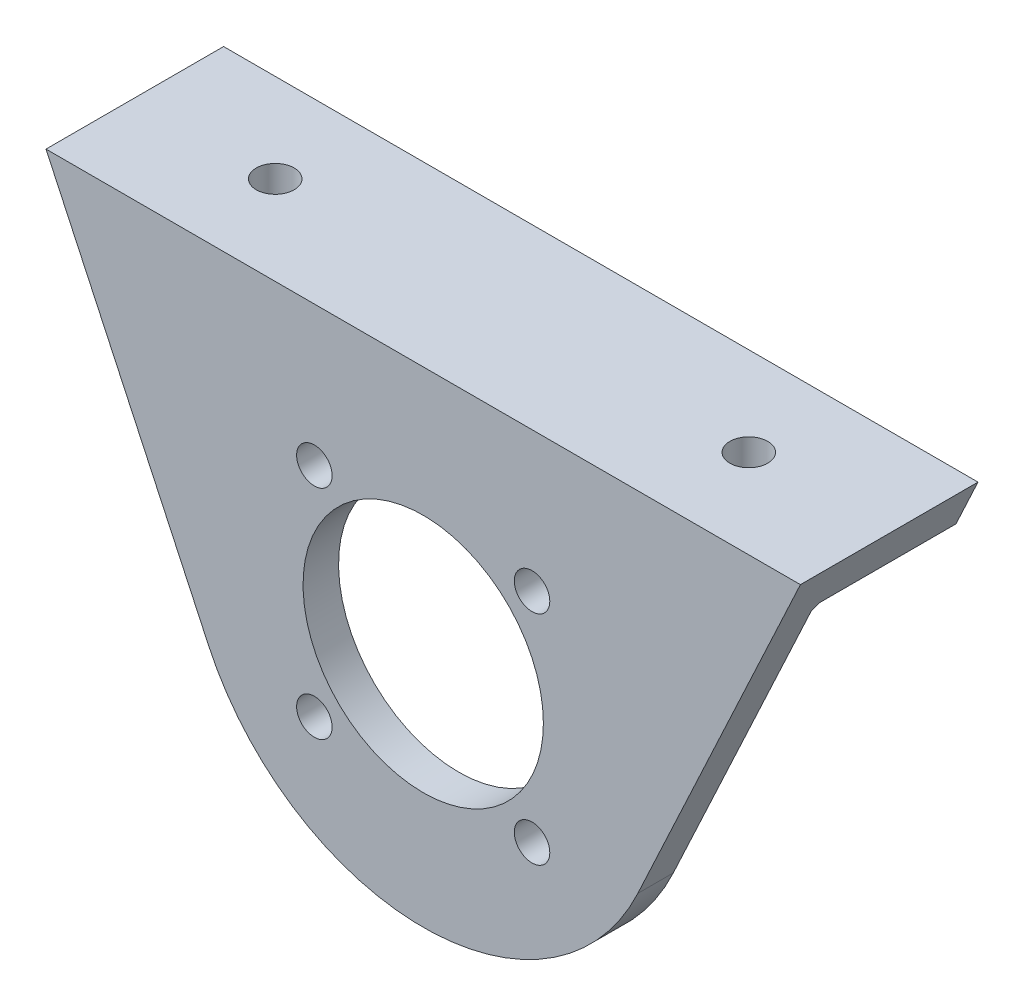
ISO-10303-21;
HEADER;
FILE_DESCRIPTION(('STEP AP214'),'2;1');
FILE_NAME('part.step','',(''),(''),'','','');
FILE_SCHEMA(('AUTOMOTIVE_DESIGN { 1 0 10303 214 1 1 1 1 }'));
ENDSEC;
DATA;
#1=APPLICATION_CONTEXT('core data for automotive mechanical design processes');
#2=APPLICATION_PROTOCOL_DEFINITION('international standard','automotive_design',2000,#1);
#3=PRODUCT_CONTEXT('',#1,'mechanical');
#4=PRODUCT('Part','Part','',(#3));
#5=PRODUCT_RELATED_PRODUCT_CATEGORY('part','',(#4));
#6=PRODUCT_DEFINITION_FORMATION('','',#4);
#7=PRODUCT_DEFINITION_CONTEXT('part definition',#1,'design');
#8=PRODUCT_DEFINITION('design','',#6,#7);
#9=PRODUCT_DEFINITION_SHAPE('','',#8);
#10=(LENGTH_UNIT() NAMED_UNIT(*) SI_UNIT(.MILLI.,.METRE.));
#11=(NAMED_UNIT(*) PLANE_ANGLE_UNIT() SI_UNIT($,.RADIAN.));
#12=(NAMED_UNIT(*) SI_UNIT($,.STERADIAN.) SOLID_ANGLE_UNIT());
#13=UNCERTAINTY_MEASURE_WITH_UNIT(LENGTH_MEASURE(1.E-05),#10,'distance_accuracy_value','');
#14=(GEOMETRIC_REPRESENTATION_CONTEXT(3) GLOBAL_UNCERTAINTY_ASSIGNED_CONTEXT((#13)) GLOBAL_UNIT_ASSIGNED_CONTEXT((#10,
#11,#12)) REPRESENTATION_CONTEXT('',''));
#15=CARTESIAN_POINT('',(0.,0.,0.));
#16=DIRECTION('',(0.,0.,1.));
#17=DIRECTION('',(1.,0.,0.));
#18=AXIS2_PLACEMENT_3D('',#15,#16,#17);
#19=CARTESIAN_POINT('',(0.,0.,15.));
#20=DIRECTION('',(0.,0.,1.));
#21=DIRECTION('',(1.,0.,0.));
#22=AXIS2_PLACEMENT_3D('',#19,#20,#21);
#23=PLANE('',#22);
#24=CARTESIAN_POINT('',(-9.19238815542512,-9.19238815542512,15.));
#25=DIRECTION('',(0.,0.,1.));
#26=DIRECTION('',(1.,0.,0.));
#27=AXIS2_PLACEMENT_3D('',#24,#25,#26);
#28=CIRCLE('',#27,1.5);
#29=CARTESIAN_POINT('',(-7.69238815542512,-9.19238815542512,15.));
#30=VERTEX_POINT('',#29);
#31=EDGE_CURVE('E177',#30,#30,#28,.T.);
#32=ORIENTED_EDGE('',*,*,#31,.F.);
#33=EDGE_LOOP('',(#32));
#34=FACE_BOUND('',#33,.T.);
#35=CARTESIAN_POINT('',(-9.19238815542512,9.19238815542512,15.));
#36=DIRECTION('',(0.,0.,1.));
#37=DIRECTION('',(1.,0.,0.));
#38=AXIS2_PLACEMENT_3D('',#35,#36,#37);
#39=CIRCLE('',#38,1.5);
#40=CARTESIAN_POINT('',(-7.69238815542512,9.19238815542512,15.));
#41=VERTEX_POINT('',#40);
#42=EDGE_CURVE('E185',#41,#41,#39,.T.);
#43=ORIENTED_EDGE('',*,*,#42,.F.);
#44=EDGE_LOOP('',(#43));
#45=FACE_BOUND('',#44,.T.);
#46=CARTESIAN_POINT('',(0.,0.,15.));
#47=DIRECTION('',(0.,0.,1.));
#48=DIRECTION('',(1.,0.,0.));
#49=AXIS2_PLACEMENT_3D('',#46,#47,#48);
#50=CIRCLE('',#49,20.);
#51=CARTESIAN_POINT('',(-18.126155740733,-8.45236523481408,15.));
#52=VERTEX_POINT('',#51);
#53=CARTESIAN_POINT('',(18.126155740733,-8.45236523481408,15.));
#54=VERTEX_POINT('',#53);
#55=EDGE_CURVE('E194',#52,#54,#50,.T.);
#56=ORIENTED_EDGE('',*,*,#55,.T.);
#57=DIRECTION('',(0.422618261740704,0.906307787036648,0.));
#58=VECTOR('',#57,1.);
#59=CARTESIAN_POINT('',(18.126155740733,-8.45236523481408,15.));
#60=LINE('',#59,#58);
#61=CARTESIAN_POINT('',(31.860019200505,21.,15.));
#62=VERTEX_POINT('',#61);
#63=EDGE_CURVE('E198',#54,#62,#60,.T.);
#64=ORIENTED_EDGE('',*,*,#63,.T.);
#65=DIRECTION('',(-1.,0.,0.));
#66=VECTOR('',#65,1.);
#67=CARTESIAN_POINT('',(-31.860019200505,21.,15.));
#68=LINE('',#67,#66);
#69=CARTESIAN_POINT('',(-31.860019200505,21.,15.));
#70=VERTEX_POINT('',#69);
#71=EDGE_CURVE('E202',#62,#70,#68,.T.);
#72=ORIENTED_EDGE('',*,*,#71,.T.);
#73=DIRECTION('',(0.422618261740704,-0.906307787036648,0.));
#74=VECTOR('',#73,1.);
#75=CARTESIAN_POINT('',(-18.126155740733,-8.45236523481408,15.));
#76=LINE('',#75,#74);
#77=EDGE_CURVE('E205',#70,#52,#76,.T.);
#78=ORIENTED_EDGE('',*,*,#77,.T.);
#79=EDGE_LOOP('',(#56,#64,#72,#78));
#80=FACE_BOUND('',#79,.T.);
#81=CARTESIAN_POINT('',(0.,0.,15.));
#82=DIRECTION('',(0.,0.,1.));
#83=DIRECTION('',(1.,0.,0.));
#84=AXIS2_PLACEMENT_3D('',#81,#82,#83);
#85=CIRCLE('',#84,10.15);
#86=CARTESIAN_POINT('',(10.15,0.,15.));
#87=VERTEX_POINT('',#86);
#88=EDGE_CURVE('E189',#87,#87,#85,.T.);
#89=ORIENTED_EDGE('',*,*,#88,.F.);
#90=EDGE_LOOP('',(#89));
#91=FACE_BOUND('',#90,.T.);
#92=CARTESIAN_POINT('',(9.19238815542511,9.19238815542512,15.));
#93=DIRECTION('',(0.,0.,1.));
#94=DIRECTION('',(1.,0.,0.));
#95=AXIS2_PLACEMENT_3D('',#92,#93,#94);
#96=CIRCLE('',#95,1.5);
#97=CARTESIAN_POINT('',(10.6923881554251,9.19238815542512,15.));
#98=VERTEX_POINT('',#97);
#99=EDGE_CURVE('E181',#98,#98,#96,.T.);
#100=ORIENTED_EDGE('',*,*,#99,.F.);
#101=EDGE_LOOP('',(#100));
#102=FACE_BOUND('',#101,.T.);
#103=CARTESIAN_POINT('',(9.19238815542512,-9.19238815542512,15.));
#104=DIRECTION('',(0.,0.,1.));
#105=DIRECTION('',(1.,0.,0.));
#106=AXIS2_PLACEMENT_3D('',#103,#104,#105);
#107=CIRCLE('',#106,1.5);
#108=CARTESIAN_POINT('',(10.6923881554251,-9.19238815542512,15.));
#109=VERTEX_POINT('',#108);
#110=EDGE_CURVE('E173',#109,#109,#107,.T.);
#111=ORIENTED_EDGE('',*,*,#110,.F.);
#112=EDGE_LOOP('',(#111));
#113=FACE_BOUND('',#112,.T.);
#114=ADVANCED_FACE('F45',(#34,#45,#80,#91,#102,#113),#23,.T.);
#115=CARTESIAN_POINT('',(0.,0.,0.));
#116=DIRECTION('',(0.,0.,1.));
#117=DIRECTION('',(1.,0.,0.));
#118=AXIS2_PLACEMENT_3D('',#115,#116,#117);
#119=PLANE('',#118);
#120=DIRECTION('',(1.,0.,0.));
#121=VECTOR('',#120,1.);
#122=CARTESIAN_POINT('',(-30.,18.,0.));
#123=LINE('',#122,#121);
#124=CARTESIAN_POINT('',(-30.,18.,0.));
#125=VERTEX_POINT('',#124);
#126=CARTESIAN_POINT('',(30.,18.,0.));
#127=VERTEX_POINT('',#126);
#128=EDGE_CURVE('E129',#125,#127,#123,.T.);
#129=ORIENTED_EDGE('',*,*,#128,.F.);
#130=DIRECTION('',(0.,1.,0.));
#131=VECTOR('',#130,1.);
#132=CARTESIAN_POINT('',(-30.,18.,0.));
#133=LINE('',#132,#131);
#134=CARTESIAN_POINT('',(-30.,17.0111759522364,0.));
#135=VERTEX_POINT('',#134);
#136=EDGE_CURVE('E117',#135,#125,#133,.T.);
#137=ORIENTED_EDGE('',*,*,#136,.F.);
#138=DIRECTION('',(0.422618261740704,-0.906307787036648,0.));
#139=VECTOR('',#138,1.);
#140=CARTESIAN_POINT('',(-18.126155740733,-8.45236523481408,0.));
#141=LINE('',#140,#139);
#142=CARTESIAN_POINT('',(-31.860019200505,21.,0.));
#143=VERTEX_POINT('',#142);
#144=EDGE_CURVE('E199',#143,#135,#141,.T.);
#145=ORIENTED_EDGE('',*,*,#144,.F.);
#146=DIRECTION('',(-1.,0.,0.));
#147=VECTOR('',#146,1.);
#148=CARTESIAN_POINT('',(-31.860019200505,21.,0.));
#149=LINE('',#148,#147);
#150=CARTESIAN_POINT('',(31.860019200505,21.,0.));
#151=VERTEX_POINT('',#150);
#152=EDGE_CURVE('E211',#151,#143,#149,.T.);
#153=ORIENTED_EDGE('',*,*,#152,.F.);
#154=DIRECTION('',(0.422618261740704,0.906307787036648,0.));
#155=VECTOR('',#154,1.);
#156=CARTESIAN_POINT('',(18.126155740733,-8.45236523481408,0.));
#157=LINE('',#156,#155);
#158=CARTESIAN_POINT('',(30.,17.0111759522364,0.));
#159=VERTEX_POINT('',#158);
#160=EDGE_CURVE('E193',#159,#151,#157,.T.);
#161=ORIENTED_EDGE('',*,*,#160,.F.);
#162=DIRECTION('',(0.,1.,0.));
#163=VECTOR('',#162,1.);
#164=CARTESIAN_POINT('',(30.,18.,0.));
#165=LINE('',#164,#163);
#166=EDGE_CURVE('E136',#159,#127,#165,.T.);
#167=ORIENTED_EDGE('',*,*,#166,.T.);
#168=EDGE_LOOP('',(#129,#137,#145,#153,#161,#167));
#169=FACE_BOUND('',#168,.T.);
#170=ADVANCED_FACE('F134',(#169),#119,.F.);
#171=CARTESIAN_POINT('',(0.,0.,15.));
#172=DIRECTION('',(0.,0.,-1.));
#173=DIRECTION('',(-1.,0.,0.));
#174=AXIS2_PLACEMENT_3D('',#171,#172,#173);
#175=CYLINDRICAL_SURFACE('',#174,20.);
#176=DIRECTION('',(0.,0.,-1.));
#177=VECTOR('',#176,1.);
#178=CARTESIAN_POINT('',(-18.126155740733,-8.45236523481408,15.));
#179=LINE('',#178,#177);
#180=CARTESIAN_POINT('',(-18.126155740733,-8.45236523481408,12.));
#181=VERTEX_POINT('',#180);
#182=EDGE_CURVE('E208',#52,#181,#179,.T.);
#183=ORIENTED_EDGE('',*,*,#182,.T.);
#184=CARTESIAN_POINT('',(0.,0.,12.));
#185=DIRECTION('',(0.,0.,1.));
#186=DIRECTION('',(0.,-1.,0.));
#187=AXIS2_PLACEMENT_3D('',#184,#185,#186);
#188=CIRCLE('',#187,20.);
#189=CARTESIAN_POINT('',(18.126155740733,-8.45236523481408,12.));
#190=VERTEX_POINT('',#189);
#191=EDGE_CURVE('E165',#181,#190,#188,.T.);
#192=ORIENTED_EDGE('',*,*,#191,.T.);
#193=DIRECTION('',(0.,0.,-1.));
#194=VECTOR('',#193,1.);
#195=CARTESIAN_POINT('',(18.126155740733,-8.45236523481408,15.));
#196=LINE('',#195,#194);
#197=EDGE_CURVE('E227',#54,#190,#196,.T.);
#198=ORIENTED_EDGE('',*,*,#197,.F.);
#199=ORIENTED_EDGE('',*,*,#55,.F.);
#200=EDGE_LOOP('',(#183,#192,#198,#199));
#201=FACE_BOUND('',#200,.T.);
#202=ADVANCED_FACE('F267',(#201),#175,.T.);
#203=CARTESIAN_POINT('',(18.126155740733,-8.45236523481408,15.));
#204=DIRECTION('',(-0.906307787036648,0.422618261740704,0.));
#205=DIRECTION('',(-0.422618261740704,-0.906307787036648,0.));
#206=AXIS2_PLACEMENT_3D('',#203,#204,#205);
#207=PLANE('',#206);
#208=ORIENTED_EDGE('',*,*,#197,.T.);
#209=DIRECTION('',(0.422618261740704,0.906307787036648,0.));
#210=VECTOR('',#209,1.);
#211=CARTESIAN_POINT('',(18.126155740733,-8.45236523481408,12.));
#212=LINE('',#211,#210);
#213=CARTESIAN_POINT('',(29.7616347388075,16.5,12.));
#214=VERTEX_POINT('',#213);
#215=EDGE_CURVE('E169',#190,#214,#212,.T.);
#216=ORIENTED_EDGE('',*,*,#215,.T.);
#217=DIRECTION('',(-0.313145613014979,-0.671542934237821,0.671542934237812));
#218=VECTOR('',#217,1.);
#219=CARTESIAN_POINT('',(22.7425345152546,1.44749099484094,27.0525090051589));
#220=LINE('',#219,#218);
#221=CARTESIAN_POINT('',(30.,17.0111759522364,11.4888240477635));
#222=VERTEX_POINT('',#221);
#223=EDGE_CURVE('E55',#214,#222,#220,.F.);
#224=ORIENTED_EDGE('',*,*,#223,.T.);
#225=DIRECTION('',(0.,0.,1.));
#226=VECTOR('',#225,1.);
#227=CARTESIAN_POINT('',(30.,17.0111759522364,15.));
#228=LINE('',#227,#226);
#229=EDGE_CURVE('E233',#159,#222,#228,.T.);
#230=ORIENTED_EDGE('',*,*,#229,.F.);
#231=ORIENTED_EDGE('',*,*,#160,.T.);
#232=DIRECTION('',(0.,0.,-1.));
#233=VECTOR('',#232,1.);
#234=CARTESIAN_POINT('',(31.860019200505,21.,15.));
#235=LINE('',#234,#233);
#236=EDGE_CURVE('E223',#62,#151,#235,.T.);
#237=ORIENTED_EDGE('',*,*,#236,.F.);
#238=ORIENTED_EDGE('',*,*,#63,.F.);
#239=EDGE_LOOP('',(#208,#216,#224,#230,#231,#237,#238));
#240=FACE_BOUND('',#239,.T.);
#241=ADVANCED_FACE('F250',(#240),#207,.F.);
#242=CARTESIAN_POINT('',(-31.860019200505,21.,15.));
#243=DIRECTION('',(0.,-1.,0.));
#244=DIRECTION('',(0.,0.,-1.));
#245=AXIS2_PLACEMENT_3D('',#242,#243,#244);
#246=PLANE('',#245);
#247=CARTESIAN_POINT('',(-20.,21.,7.5));
#248=DIRECTION('',(0.,1.,0.));
#249=DIRECTION('',(0.,0.,1.));
#250=AXIS2_PLACEMENT_3D('',#247,#248,#249);
#251=CIRCLE('',#250,1.6);
#252=CARTESIAN_POINT('',(-20.,21.,9.1));
#253=VERTEX_POINT('',#252);
#254=EDGE_CURVE('E339',#253,#253,#251,.T.);
#255=ORIENTED_EDGE('',*,*,#254,.F.);
#256=EDGE_LOOP('',(#255));
#257=FACE_BOUND('',#256,.T.);
#258=CARTESIAN_POINT('',(20.,21.,7.5));
#259=DIRECTION('',(0.,1.,0.));
#260=DIRECTION('',(0.,0.,1.));
#261=AXIS2_PLACEMENT_3D('',#258,#259,#260);
#262=CIRCLE('',#261,1.6);
#263=CARTESIAN_POINT('',(20.,21.,9.1));
#264=VERTEX_POINT('',#263);
#265=EDGE_CURVE('E347',#264,#264,#262,.T.);
#266=ORIENTED_EDGE('',*,*,#265,.F.);
#267=EDGE_LOOP('',(#266));
#268=FACE_BOUND('',#267,.T.);
#269=ORIENTED_EDGE('',*,*,#152,.T.);
#270=DIRECTION('',(0.,0.,-1.));
#271=VECTOR('',#270,1.);
#272=CARTESIAN_POINT('',(-31.860019200505,21.,15.));
#273=LINE('',#272,#271);
#274=EDGE_CURVE('E219',#70,#143,#273,.T.);
#275=ORIENTED_EDGE('',*,*,#274,.F.);
#276=ORIENTED_EDGE('',*,*,#71,.F.);
#277=ORIENTED_EDGE('',*,*,#236,.T.);
#278=EDGE_LOOP('',(#269,#275,#276,#277));
#279=FACE_BOUND('',#278,.T.);
#280=ADVANCED_FACE('F275',(#257,#268,#279),#246,.F.);
#281=CARTESIAN_POINT('',(-18.126155740733,-8.45236523481408,15.));
#282=DIRECTION('',(0.906307787036648,0.422618261740704,0.));
#283=DIRECTION('',(-0.422618261740704,0.906307787036648,0.));
#284=AXIS2_PLACEMENT_3D('',#281,#282,#283);
#285=PLANE('',#284);
#286=DIRECTION('',(0.,0.,1.));
#287=VECTOR('',#286,1.);
#288=CARTESIAN_POINT('',(-30.,17.0111759522364,15.));
#289=LINE('',#288,#287);
#290=CARTESIAN_POINT('',(-30.,17.0111759522364,11.4888240477635));
#291=VERTEX_POINT('',#290);
#292=EDGE_CURVE('E120',#135,#291,#289,.T.);
#293=ORIENTED_EDGE('',*,*,#292,.T.);
#294=DIRECTION('',(-0.313145613014979,0.671542934237821,-0.671542934237812));
#295=VECTOR('',#294,1.);
#296=CARTESIAN_POINT('',(-22.7425345152546,1.44749099484094,27.0525090051589));
#297=LINE('',#296,#295);
#298=CARTESIAN_POINT('',(-29.7616347388075,16.5,12.));
#299=VERTEX_POINT('',#298);
#300=EDGE_CURVE('E11',#291,#299,#297,.F.);
#301=ORIENTED_EDGE('',*,*,#300,.T.);
#302=DIRECTION('',(0.422618261740704,-0.906307787036648,0.));
#303=VECTOR('',#302,1.);
#304=CARTESIAN_POINT('',(-18.126155740733,-8.45236523481408,12.));
#305=LINE('',#304,#303);
#306=EDGE_CURVE('E162',#299,#181,#305,.T.);
#307=ORIENTED_EDGE('',*,*,#306,.T.);
#308=ORIENTED_EDGE('',*,*,#182,.F.);
#309=ORIENTED_EDGE('',*,*,#77,.F.);
#310=ORIENTED_EDGE('',*,*,#274,.T.);
#311=ORIENTED_EDGE('',*,*,#144,.T.);
#312=EDGE_LOOP('',(#293,#301,#307,#308,#309,#310,#311));
#313=FACE_BOUND('',#312,.T.);
#314=ADVANCED_FACE('F259',(#313),#285,.F.);
#315=CARTESIAN_POINT('',(0.,0.,15.));
#316=DIRECTION('',(0.,0.,-1.));
#317=DIRECTION('',(-1.,0.,0.));
#318=AXIS2_PLACEMENT_3D('',#315,#316,#317);
#319=CYLINDRICAL_SURFACE('',#318,10.15);
#320=CARTESIAN_POINT('',(0.,0.,12.));
#321=DIRECTION('',(0.,0.,1.));
#322=DIRECTION('',(0.,-1.,0.));
#323=AXIS2_PLACEMENT_3D('',#320,#321,#322);
#324=CIRCLE('',#323,10.15);
#325=CARTESIAN_POINT('',(0.,-10.15,12.));
#326=VERTEX_POINT('',#325);
#327=EDGE_CURVE('E158',#326,#326,#324,.T.);
#328=ORIENTED_EDGE('',*,*,#327,.F.);
#329=EDGE_LOOP('',(#328));
#330=FACE_BOUND('',#329,.T.);
#331=ORIENTED_EDGE('',*,*,#88,.T.);
#332=EDGE_LOOP('',(#331));
#333=FACE_BOUND('',#332,.T.);
#334=ADVANCED_FACE('F284',(#330,#333),#319,.F.);
#335=CARTESIAN_POINT('',(-9.19238815542512,9.19238815542512,15.));
#336=DIRECTION('',(0.,0.,-1.));
#337=DIRECTION('',(-1.,0.,0.));
#338=AXIS2_PLACEMENT_3D('',#335,#336,#337);
#339=CYLINDRICAL_SURFACE('',#338,1.5);
#340=CARTESIAN_POINT('',(-9.19238815542512,9.19238815542512,12.));
#341=DIRECTION('',(0.,0.,1.));
#342=DIRECTION('',(0.,-1.,0.));
#343=AXIS2_PLACEMENT_3D('',#340,#341,#342);
#344=CIRCLE('',#343,1.5);
#345=CARTESIAN_POINT('',(-9.19238815542512,7.69238815542512,12.));
#346=VERTEX_POINT('',#345);
#347=EDGE_CURVE('E154',#346,#346,#344,.T.);
#348=ORIENTED_EDGE('',*,*,#347,.F.);
#349=EDGE_LOOP('',(#348));
#350=FACE_BOUND('',#349,.T.);
#351=ORIENTED_EDGE('',*,*,#42,.T.);
#352=EDGE_LOOP('',(#351));
#353=FACE_BOUND('',#352,.T.);
#354=ADVANCED_FACE('F301',(#350,#353),#339,.F.);
#355=CARTESIAN_POINT('',(9.19238815542511,9.19238815542512,15.));
#356=DIRECTION('',(0.,0.,-1.));
#357=DIRECTION('',(-1.,0.,0.));
#358=AXIS2_PLACEMENT_3D('',#355,#356,#357);
#359=CYLINDRICAL_SURFACE('',#358,1.5);
#360=CARTESIAN_POINT('',(9.19238815542511,9.19238815542512,12.));
#361=DIRECTION('',(0.,0.,1.));
#362=DIRECTION('',(0.,-1.,0.));
#363=AXIS2_PLACEMENT_3D('',#360,#361,#362);
#364=CIRCLE('',#363,1.5);
#365=CARTESIAN_POINT('',(9.19238815542511,7.69238815542511,12.));
#366=VERTEX_POINT('',#365);
#367=EDGE_CURVE('E150',#366,#366,#364,.T.);
#368=ORIENTED_EDGE('',*,*,#367,.F.);
#369=EDGE_LOOP('',(#368));
#370=FACE_BOUND('',#369,.T.);
#371=ORIENTED_EDGE('',*,*,#99,.T.);
#372=EDGE_LOOP('',(#371));
#373=FACE_BOUND('',#372,.T.);
#374=ADVANCED_FACE('F305',(#370,#373),#359,.F.);
#375=CARTESIAN_POINT('',(-9.19238815542512,-9.19238815542512,15.));
#376=DIRECTION('',(0.,0.,-1.));
#377=DIRECTION('',(-1.,0.,0.));
#378=AXIS2_PLACEMENT_3D('',#375,#376,#377);
#379=CYLINDRICAL_SURFACE('',#378,1.5);
#380=CARTESIAN_POINT('',(-9.19238815542512,-9.19238815542512,12.));
#381=DIRECTION('',(0.,0.,1.));
#382=DIRECTION('',(0.,-1.,0.));
#383=AXIS2_PLACEMENT_3D('',#380,#381,#382);
#384=CIRCLE('',#383,1.5);
#385=CARTESIAN_POINT('',(-9.19238815542512,-10.6923881554251,12.));
#386=VERTEX_POINT('',#385);
#387=EDGE_CURVE('E142',#386,#386,#384,.T.);
#388=ORIENTED_EDGE('',*,*,#387,.F.);
#389=EDGE_LOOP('',(#388));
#390=FACE_BOUND('',#389,.T.);
#391=ORIENTED_EDGE('',*,*,#31,.T.);
#392=EDGE_LOOP('',(#391));
#393=FACE_BOUND('',#392,.T.);
#394=ADVANCED_FACE('F309',(#390,#393),#379,.F.);
#395=CARTESIAN_POINT('',(9.19238815542512,-9.19238815542512,15.));
#396=DIRECTION('',(0.,0.,-1.));
#397=DIRECTION('',(-1.,0.,0.));
#398=AXIS2_PLACEMENT_3D('',#395,#396,#397);
#399=CYLINDRICAL_SURFACE('',#398,1.5);
#400=CARTESIAN_POINT('',(9.19238815542512,-9.19238815542512,12.));
#401=DIRECTION('',(0.,0.,1.));
#402=DIRECTION('',(0.,-1.,0.));
#403=AXIS2_PLACEMENT_3D('',#400,#401,#402);
#404=CIRCLE('',#403,1.5);
#405=CARTESIAN_POINT('',(9.19238815542512,-10.6923881554251,12.));
#406=VERTEX_POINT('',#405);
#407=EDGE_CURVE('E138',#406,#406,#404,.T.);
#408=ORIENTED_EDGE('',*,*,#407,.F.);
#409=EDGE_LOOP('',(#408));
#410=FACE_BOUND('',#409,.T.);
#411=ORIENTED_EDGE('',*,*,#110,.T.);
#412=EDGE_LOOP('',(#411));
#413=FACE_BOUND('',#412,.T.);
#414=ADVANCED_FACE('F313',(#410,#413),#399,.F.);
#415=CARTESIAN_POINT('',(30.,0.,0.));
#416=DIRECTION('',(-1.,0.,0.));
#417=DIRECTION('',(0.,0.,1.));
#418=AXIS2_PLACEMENT_3D('',#415,#416,#417);
#419=PLANE('',#418);
#420=ORIENTED_EDGE('',*,*,#229,.T.);
#421=DIRECTION('',(0.,-0.707106781186552,0.707106781186543));
#422=VECTOR('',#421,1.);
#423=CARTESIAN_POINT('',(30.,14.2499999999999,14.2500000000001));
#424=LINE('',#423,#422);
#425=CARTESIAN_POINT('',(30.,18.,10.5));
#426=VERTEX_POINT('',#425);
#427=EDGE_CURVE('E241',#222,#426,#424,.F.);
#428=ORIENTED_EDGE('',*,*,#427,.T.);
#429=DIRECTION('',(0.,0.,1.));
#430=VECTOR('',#429,1.);
#431=CARTESIAN_POINT('',(30.,18.,0.));
#432=LINE('',#431,#430);
#433=EDGE_CURVE('E126',#127,#426,#432,.T.);
#434=ORIENTED_EDGE('',*,*,#433,.F.);
#435=ORIENTED_EDGE('',*,*,#166,.F.);
#436=EDGE_LOOP('',(#420,#428,#434,#435));
#437=FACE_BOUND('',#436,.T.);
#438=ADVANCED_FACE('F255',(#437),#419,.T.);
#439=CARTESIAN_POINT('',(-30.,0.,0.));
#440=DIRECTION('',(-1.,0.,0.));
#441=DIRECTION('',(0.,0.,1.));
#442=AXIS2_PLACEMENT_3D('',#439,#440,#441);
#443=PLANE('',#442);
#444=DIRECTION('',(0.,0.,1.));
#445=VECTOR('',#444,1.);
#446=CARTESIAN_POINT('',(-30.,18.,0.));
#447=LINE('',#446,#445);
#448=CARTESIAN_POINT('',(-30.,18.,10.5));
#449=VERTEX_POINT('',#448);
#450=EDGE_CURVE('E119',#125,#449,#447,.T.);
#451=ORIENTED_EDGE('',*,*,#450,.T.);
#452=DIRECTION('',(0.,0.707106781186552,-0.707106781186543));
#453=VECTOR('',#452,1.);
#454=CARTESIAN_POINT('',(-30.,16.5,12.));
#455=LINE('',#454,#453);
#456=EDGE_CURVE('E62',#449,#291,#455,.F.);
#457=ORIENTED_EDGE('',*,*,#456,.T.);
#458=ORIENTED_EDGE('',*,*,#292,.F.);
#459=ORIENTED_EDGE('',*,*,#136,.T.);
#460=EDGE_LOOP('',(#451,#457,#458,#459));
#461=FACE_BOUND('',#460,.T.);
#462=ADVANCED_FACE('F118',(#461),#443,.F.);
#463=CARTESIAN_POINT('',(-30.,18.,12.));
#464=DIRECTION('',(0.,0.,1.));
#465=DIRECTION('',(0.,-1.,0.));
#466=AXIS2_PLACEMENT_3D('',#463,#464,#465);
#467=PLANE('',#466);
#468=ORIENTED_EDGE('',*,*,#327,.T.);
#469=EDGE_LOOP('',(#468));
#470=FACE_BOUND('',#469,.T.);
#471=ORIENTED_EDGE('',*,*,#347,.T.);
#472=EDGE_LOOP('',(#471));
#473=FACE_BOUND('',#472,.T.);
#474=ORIENTED_EDGE('',*,*,#367,.T.);
#475=EDGE_LOOP('',(#474));
#476=FACE_BOUND('',#475,.T.);
#477=ORIENTED_EDGE('',*,*,#387,.T.);
#478=EDGE_LOOP('',(#477));
#479=FACE_BOUND('',#478,.T.);
#480=ORIENTED_EDGE('',*,*,#407,.T.);
#481=EDGE_LOOP('',(#480));
#482=FACE_BOUND('',#481,.T.);
#483=ORIENTED_EDGE('',*,*,#306,.F.);
#484=DIRECTION('',(1.,0.,0.));
#485=VECTOR('',#484,1.);
#486=CARTESIAN_POINT('',(30.,16.5,12.));
#487=LINE('',#486,#485);
#488=EDGE_CURVE('E237',#299,#214,#487,.T.);
#489=ORIENTED_EDGE('',*,*,#488,.T.);
#490=ORIENTED_EDGE('',*,*,#215,.F.);
#491=ORIENTED_EDGE('',*,*,#191,.F.);
#492=EDGE_LOOP('',(#483,#489,#490,#491));
#493=FACE_BOUND('',#492,.T.);
#494=ADVANCED_FACE('F263',(#470,#473,#476,#479,#482,#493),#467,.F.);
#495=CARTESIAN_POINT('',(-30.,18.,0.));
#496=DIRECTION('',(0.,1.,0.));
#497=DIRECTION('',(0.,0.,1.));
#498=AXIS2_PLACEMENT_3D('',#495,#496,#497);
#499=PLANE('',#498);
#500=CARTESIAN_POINT('',(-20.,18.,7.5));
#501=DIRECTION('',(0.,1.,0.));
#502=DIRECTION('',(0.,0.,1.));
#503=AXIS2_PLACEMENT_3D('',#500,#501,#502);
#504=CIRCLE('',#503,1.6);
#505=CARTESIAN_POINT('',(-20.,18.,9.1));
#506=VERTEX_POINT('',#505);
#507=EDGE_CURVE('E342',#506,#506,#504,.F.);
#508=ORIENTED_EDGE('',*,*,#507,.F.);
#509=EDGE_LOOP('',(#508));
#510=FACE_BOUND('',#509,.T.);
#511=CARTESIAN_POINT('',(20.,18.,7.5));
#512=DIRECTION('',(0.,1.,0.));
#513=DIRECTION('',(0.,0.,1.));
#514=AXIS2_PLACEMENT_3D('',#511,#512,#513);
#515=CIRCLE('',#514,1.6);
#516=CARTESIAN_POINT('',(20.,18.,9.1));
#517=VERTEX_POINT('',#516);
#518=EDGE_CURVE('E350',#517,#517,#515,.F.);
#519=ORIENTED_EDGE('',*,*,#518,.F.);
#520=EDGE_LOOP('',(#519));
#521=FACE_BOUND('',#520,.T.);
#522=ORIENTED_EDGE('',*,*,#433,.T.);
#523=DIRECTION('',(-1.,0.,0.));
#524=VECTOR('',#523,1.);
#525=CARTESIAN_POINT('',(-30.,18.,10.5));
#526=LINE('',#525,#524);
#527=EDGE_CURVE('E70',#426,#449,#526,.T.);
#528=ORIENTED_EDGE('',*,*,#527,.T.);
#529=ORIENTED_EDGE('',*,*,#450,.F.);
#530=ORIENTED_EDGE('',*,*,#128,.T.);
#531=EDGE_LOOP('',(#522,#528,#529,#530));
#532=FACE_BOUND('',#531,.T.);
#533=ADVANCED_FACE('F128',(#510,#521,#532),#499,.F.);
#534=CARTESIAN_POINT('',(-30.,16.5,12.));
#535=DIRECTION('',(0.,-0.707106781186543,-0.707106781186552));
#536=DIRECTION('',(-1.,0.,0.));
#537=AXIS2_PLACEMENT_3D('',#534,#535,#536);
#538=PLANE('',#537);
#539=ORIENTED_EDGE('',*,*,#456,.F.);
#540=ORIENTED_EDGE('',*,*,#527,.F.);
#541=ORIENTED_EDGE('',*,*,#427,.F.);
#542=ORIENTED_EDGE('',*,*,#223,.F.);
#543=ORIENTED_EDGE('',*,*,#488,.F.);
#544=ORIENTED_EDGE('',*,*,#300,.F.);
#545=EDGE_LOOP('',(#539,#540,#541,#542,#543,#544));
#546=FACE_BOUND('',#545,.T.);
#547=ADVANCED_FACE('F48',(#546),#538,.T.);
#548=CARTESIAN_POINT('',(20.,-20.001,7.5));
#549=DIRECTION('',(0.,1.,0.));
#550=DIRECTION('',(0.,0.,1.));
#551=AXIS2_PLACEMENT_3D('',#548,#549,#550);
#552=CYLINDRICAL_SURFACE('',#551,1.6);
#553=CARTESIAN_POINT('',(20.,21.,9.1));
#554=CARTESIAN_POINT('',(20.,20.96875,9.1));
#555=CARTESIAN_POINT('',(20.,20.9375,9.1));
#556=CARTESIAN_POINT('',(20.,20.875,9.1));
#557=CARTESIAN_POINT('',(20.,20.84375,9.1));
#558=CARTESIAN_POINT('',(20.,20.78125,9.1));
#559=CARTESIAN_POINT('',(20.,20.75,9.1));
#560=CARTESIAN_POINT('',(20.,20.6875,9.1));
#561=CARTESIAN_POINT('',(20.,20.65625,9.1));
#562=CARTESIAN_POINT('',(20.,20.59375,9.1));
#563=CARTESIAN_POINT('',(20.,20.5625,9.1));
#564=CARTESIAN_POINT('',(20.,20.5,9.1));
#565=CARTESIAN_POINT('',(20.,20.46875,9.1));
#566=CARTESIAN_POINT('',(20.,20.40625,9.1));
#567=CARTESIAN_POINT('',(20.,20.375,9.1));
#568=CARTESIAN_POINT('',(20.,20.3125,9.1));
#569=CARTESIAN_POINT('',(20.,20.28125,9.1));
#570=CARTESIAN_POINT('',(20.,20.21875,9.1));
#571=CARTESIAN_POINT('',(20.,20.1875,9.1));
#572=CARTESIAN_POINT('',(20.,20.125,9.1));
#573=CARTESIAN_POINT('',(20.,20.09375,9.1));
#574=CARTESIAN_POINT('',(20.,20.03125,9.1));
#575=CARTESIAN_POINT('',(20.,20.,9.1));
#576=CARTESIAN_POINT('',(20.,19.9375,9.1));
#577=CARTESIAN_POINT('',(20.,19.90625,9.1));
#578=CARTESIAN_POINT('',(20.,19.84375,9.1));
#579=CARTESIAN_POINT('',(20.,19.8125,9.1));
#580=CARTESIAN_POINT('',(20.,19.75,9.1));
#581=CARTESIAN_POINT('',(20.,19.71875,9.1));
#582=CARTESIAN_POINT('',(20.,19.65625,9.1));
#583=CARTESIAN_POINT('',(20.,19.625,9.1));
#584=CARTESIAN_POINT('',(20.,19.5625,9.1));
#585=CARTESIAN_POINT('',(20.,19.53125,9.1));
#586=CARTESIAN_POINT('',(20.,19.46875,9.1));
#587=CARTESIAN_POINT('',(20.,19.4375,9.1));
#588=CARTESIAN_POINT('',(20.,19.375,9.1));
#589=CARTESIAN_POINT('',(20.,19.34375,9.1));
#590=CARTESIAN_POINT('',(20.,19.28125,9.1));
#591=CARTESIAN_POINT('',(20.,19.25,9.1));
#592=CARTESIAN_POINT('',(20.,19.1875,9.1));
#593=CARTESIAN_POINT('',(20.,19.15625,9.1));
#594=CARTESIAN_POINT('',(20.,19.09375,9.1));
#595=CARTESIAN_POINT('',(20.,19.0625,9.1));
#596=CARTESIAN_POINT('',(20.,19.,9.1));
#597=CARTESIAN_POINT('',(20.,18.96875,9.1));
#598=CARTESIAN_POINT('',(20.,18.90625,9.1));
#599=CARTESIAN_POINT('',(20.,18.875,9.1));
#600=CARTESIAN_POINT('',(20.,18.8125,9.1));
#601=CARTESIAN_POINT('',(20.,18.78125,9.1));
#602=CARTESIAN_POINT('',(20.,18.71875,9.1));
#603=CARTESIAN_POINT('',(20.,18.6875,9.1));
#604=CARTESIAN_POINT('',(20.,18.625,9.1));
#605=CARTESIAN_POINT('',(20.,18.59375,9.1));
#606=CARTESIAN_POINT('',(20.,18.53125,9.1));
#607=CARTESIAN_POINT('',(20.,18.5,9.1));
#608=CARTESIAN_POINT('',(20.,18.4375,9.1));
#609=CARTESIAN_POINT('',(20.,18.40625,9.1));
#610=CARTESIAN_POINT('',(20.,18.34375,9.1));
#611=CARTESIAN_POINT('',(20.,18.3125,9.1));
#612=CARTESIAN_POINT('',(20.,18.25,9.1));
#613=CARTESIAN_POINT('',(20.,18.21875,9.1));
#614=CARTESIAN_POINT('',(20.,18.15625,9.1));
#615=CARTESIAN_POINT('',(20.,18.125,9.1));
#616=CARTESIAN_POINT('',(20.,18.0625,9.1));
#617=CARTESIAN_POINT('',(20.,18.03125,9.1));
#618=CARTESIAN_POINT('',(20.,18.,9.1));
#619=B_SPLINE_CURVE_WITH_KNOTS('',3,(#553,#554,#555,#556,#557,#558,#559,#560,#561,#562,#563,
#564,#565,#566,#567,#568,#569,#570,#571,#572,#573,#574,#575,#576,#577,#578,#579,#580,#581,#582,
#583,#584,#585,#586,#587,#588,#589,#590,#591,#592,#593,#594,#595,#596,#597,#598,#599,#600,#601,
#602,#603,#604,#605,#606,#607,#608,#609,#610,#611,#612,#613,#614,#615,#616,#617,#618),
.UNSPECIFIED.,.F.,.F.,(4,2,2,2,2,2,2,2,2,2,2,2,2,2,2,2,2,2,2,2,2,2,2,2,2,2,2,2,2,2,2,2,4),(0.,
0.0937500000000036,0.1875,0.281249999999997,0.375,0.468750000000004,0.5625,0.656249999999997,
0.750000000000001,0.843750000000004,0.937500000000001,1.03125,1.125,1.21875,1.3125,1.40625,1.5,
1.59375,1.6875,1.78125,1.875,1.96875000000001,2.0625,2.15625,2.25,2.34375000000001,2.4375,
2.53125,2.625,2.71875000000001,2.8125,2.90625,3.),.UNSPECIFIED.);
#620=EDGE_CURVE('BSEAM328',#264,#517,#619,.T.);
#621=ORIENTED_EDGE('',*,*,#265,.T.);
#622=ORIENTED_EDGE('',*,*,#518,.T.);
#623=ORIENTED_EDGE('',*,*,#620,.T.);
#624=ORIENTED_EDGE('',*,*,#620,.F.);
#625=EDGE_LOOP('',(#621,#623,#622,#624));
#626=FACE_BOUND('',#625,.T.);
#627=ADVANCED_FACE('F328',(#626),#552,.F.);
#628=CARTESIAN_POINT('',(-20.,-20.001,7.5));
#629=DIRECTION('',(0.,1.,0.));
#630=DIRECTION('',(0.,0.,1.));
#631=AXIS2_PLACEMENT_3D('',#628,#629,#630);
#632=CYLINDRICAL_SURFACE('',#631,1.6);
#633=CARTESIAN_POINT('',(-20.,21.,9.1));
#634=CARTESIAN_POINT('',(-20.,20.96875,9.1));
#635=CARTESIAN_POINT('',(-20.,20.9375,9.1));
#636=CARTESIAN_POINT('',(-20.,20.875,9.1));
#637=CARTESIAN_POINT('',(-20.,20.84375,9.1));
#638=CARTESIAN_POINT('',(-20.,20.78125,9.1));
#639=CARTESIAN_POINT('',(-20.,20.75,9.1));
#640=CARTESIAN_POINT('',(-20.,20.6875,9.1));
#641=CARTESIAN_POINT('',(-20.,20.65625,9.1));
#642=CARTESIAN_POINT('',(-20.,20.59375,9.1));
#643=CARTESIAN_POINT('',(-20.,20.5625,9.1));
#644=CARTESIAN_POINT('',(-20.,20.5,9.1));
#645=CARTESIAN_POINT('',(-20.,20.46875,9.1));
#646=CARTESIAN_POINT('',(-20.,20.40625,9.1));
#647=CARTESIAN_POINT('',(-20.,20.375,9.1));
#648=CARTESIAN_POINT('',(-20.,20.3125,9.1));
#649=CARTESIAN_POINT('',(-20.,20.28125,9.1));
#650=CARTESIAN_POINT('',(-20.,20.21875,9.1));
#651=CARTESIAN_POINT('',(-20.,20.1875,9.1));
#652=CARTESIAN_POINT('',(-20.,20.125,9.1));
#653=CARTESIAN_POINT('',(-20.,20.09375,9.1));
#654=CARTESIAN_POINT('',(-20.,20.03125,9.1));
#655=CARTESIAN_POINT('',(-20.,20.,9.1));
#656=CARTESIAN_POINT('',(-20.,19.9375,9.1));
#657=CARTESIAN_POINT('',(-20.,19.90625,9.1));
#658=CARTESIAN_POINT('',(-20.,19.84375,9.1));
#659=CARTESIAN_POINT('',(-20.,19.8125,9.1));
#660=CARTESIAN_POINT('',(-20.,19.75,9.1));
#661=CARTESIAN_POINT('',(-20.,19.71875,9.1));
#662=CARTESIAN_POINT('',(-20.,19.65625,9.1));
#663=CARTESIAN_POINT('',(-20.,19.625,9.1));
#664=CARTESIAN_POINT('',(-20.,19.5625,9.1));
#665=CARTESIAN_POINT('',(-20.,19.53125,9.1));
#666=CARTESIAN_POINT('',(-20.,19.46875,9.1));
#667=CARTESIAN_POINT('',(-20.,19.4375,9.1));
#668=CARTESIAN_POINT('',(-20.,19.375,9.1));
#669=CARTESIAN_POINT('',(-20.,19.34375,9.1));
#670=CARTESIAN_POINT('',(-20.,19.28125,9.1));
#671=CARTESIAN_POINT('',(-20.,19.25,9.1));
#672=CARTESIAN_POINT('',(-20.,19.1875,9.1));
#673=CARTESIAN_POINT('',(-20.,19.15625,9.1));
#674=CARTESIAN_POINT('',(-20.,19.09375,9.1));
#675=CARTESIAN_POINT('',(-20.,19.0625,9.1));
#676=CARTESIAN_POINT('',(-20.,19.,9.1));
#677=CARTESIAN_POINT('',(-20.,18.96875,9.1));
#678=CARTESIAN_POINT('',(-20.,18.90625,9.1));
#679=CARTESIAN_POINT('',(-20.,18.875,9.1));
#680=CARTESIAN_POINT('',(-20.,18.8125,9.1));
#681=CARTESIAN_POINT('',(-20.,18.78125,9.1));
#682=CARTESIAN_POINT('',(-20.,18.71875,9.1));
#683=CARTESIAN_POINT('',(-20.,18.6875,9.1));
#684=CARTESIAN_POINT('',(-20.,18.625,9.1));
#685=CARTESIAN_POINT('',(-20.,18.59375,9.1));
#686=CARTESIAN_POINT('',(-20.,18.53125,9.1));
#687=CARTESIAN_POINT('',(-20.,18.5,9.1));
#688=CARTESIAN_POINT('',(-20.,18.4375,9.1));
#689=CARTESIAN_POINT('',(-20.,18.40625,9.1));
#690=CARTESIAN_POINT('',(-20.,18.34375,9.1));
#691=CARTESIAN_POINT('',(-20.,18.3125,9.1));
#692=CARTESIAN_POINT('',(-20.,18.25,9.1));
#693=CARTESIAN_POINT('',(-20.,18.21875,9.1));
#694=CARTESIAN_POINT('',(-20.,18.15625,9.1));
#695=CARTESIAN_POINT('',(-20.,18.125,9.1));
#696=CARTESIAN_POINT('',(-20.,18.0625,9.1));
#697=CARTESIAN_POINT('',(-20.,18.03125,9.1));
#698=CARTESIAN_POINT('',(-20.,18.,9.1));
#699=B_SPLINE_CURVE_WITH_KNOTS('',3,(#633,#634,#635,#636,#637,#638,#639,#640,#641,#642,#643,
#644,#645,#646,#647,#648,#649,#650,#651,#652,#653,#654,#655,#656,#657,#658,#659,#660,#661,#662,
#663,#664,#665,#666,#667,#668,#669,#670,#671,#672,#673,#674,#675,#676,#677,#678,#679,#680,#681,
#682,#683,#684,#685,#686,#687,#688,#689,#690,#691,#692,#693,#694,#695,#696,#697,#698),
.UNSPECIFIED.,.F.,.F.,(4,2,2,2,2,2,2,2,2,2,2,2,2,2,2,2,2,2,2,2,2,2,2,2,2,2,2,2,2,2,2,2,4),(0.,
0.0937500000000036,0.1875,0.281249999999997,0.375,0.468750000000004,0.5625,0.656249999999997,
0.750000000000001,0.843750000000004,0.937500000000001,1.03125,1.125,1.21875,1.3125,1.40625,1.5,
1.59375,1.6875,1.78125,1.875,1.96875000000001,2.0625,2.15625,2.25,2.34375000000001,2.4375,
2.53125,2.625,2.71875000000001,2.8125,2.90625,3.),.UNSPECIFIED.);
#700=EDGE_CURVE('BSEAM331',#253,#506,#699,.T.);
#701=ORIENTED_EDGE('',*,*,#254,.T.);
#702=ORIENTED_EDGE('',*,*,#507,.T.);
#703=ORIENTED_EDGE('',*,*,#700,.T.);
#704=ORIENTED_EDGE('',*,*,#700,.F.);
#705=EDGE_LOOP('',(#701,#703,#702,#704));
#706=FACE_BOUND('',#705,.T.);
#707=ADVANCED_FACE('F331',(#706),#632,.F.);
#708=CLOSED_SHELL('',(#114,#170,#202,#241,#280,#314,#334,#354,#374,#394,#414,#438,#462,#494,
#533,#547,#627,#707));
#709=MANIFOLD_SOLID_BREP('B2',#708);
#710=ADVANCED_BREP_SHAPE_REPRESENTATION('',(#18,#709),#14);
#711=SHAPE_DEFINITION_REPRESENTATION(#9,#710);
ENDSEC;
END-ISO-10303-21;
